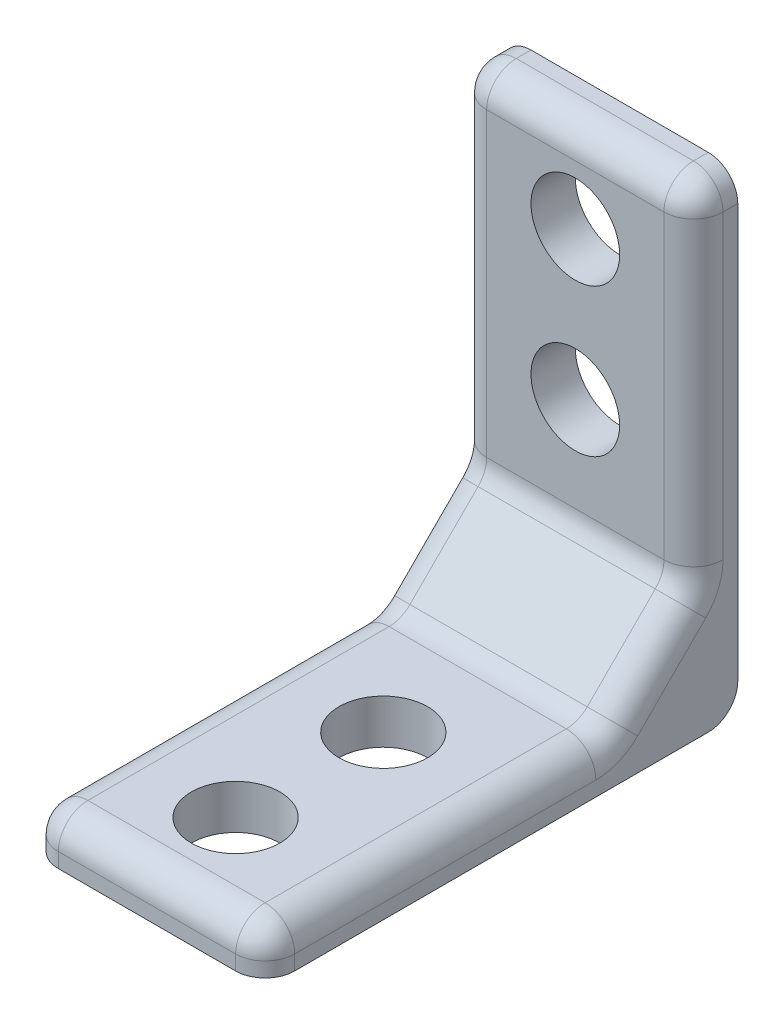
ISO-10303-21;
HEADER;
FILE_DESCRIPTION(('STEP AP214'),'2;1');
FILE_NAME('part.step','',(''),(''),'','','');
FILE_SCHEMA(('AUTOMOTIVE_DESIGN { 1 0 10303 214 1 1 1 1 }'));
ENDSEC;
DATA;
#1=APPLICATION_CONTEXT('core data for automotive mechanical design processes');
#2=APPLICATION_PROTOCOL_DEFINITION('international standard','automotive_design',2000,#1);
#3=PRODUCT_CONTEXT('',#1,'mechanical');
#4=PRODUCT('Part','Part','',(#3));
#5=PRODUCT_RELATED_PRODUCT_CATEGORY('part','',(#4));
#6=PRODUCT_DEFINITION_FORMATION('','',#4);
#7=PRODUCT_DEFINITION_CONTEXT('part definition',#1,'design');
#8=PRODUCT_DEFINITION('design','',#6,#7);
#9=PRODUCT_DEFINITION_SHAPE('','',#8);
#10=(LENGTH_UNIT() NAMED_UNIT(*) SI_UNIT(.MILLI.,.METRE.));
#11=(NAMED_UNIT(*) PLANE_ANGLE_UNIT() SI_UNIT($,.RADIAN.));
#12=(NAMED_UNIT(*) SI_UNIT($,.STERADIAN.) SOLID_ANGLE_UNIT());
#13=UNCERTAINTY_MEASURE_WITH_UNIT(LENGTH_MEASURE(1.E-05),#10,'distance_accuracy_value','');
#14=(GEOMETRIC_REPRESENTATION_CONTEXT(3) GLOBAL_UNCERTAINTY_ASSIGNED_CONTEXT((#13)) GLOBAL_UNIT_ASSIGNED_CONTEXT((#10,
#11,#12)) REPRESENTATION_CONTEXT('',''));
#15=CARTESIAN_POINT('',(0.,0.,0.));
#16=DIRECTION('',(0.,0.,1.));
#17=DIRECTION('',(1.,0.,0.));
#18=AXIS2_PLACEMENT_3D('',#15,#16,#17);
#19=CARTESIAN_POINT('',(5.08,0.,20.32));
#20=DIRECTION('',(0.,1.,0.));
#21=DIRECTION('',(0.,0.,1.));
#22=AXIS2_PLACEMENT_3D('',#19,#20,#21);
#23=PLANE('',#22);
#24=CARTESIAN_POINT('',(0.,0.,16.51));
#25=DIRECTION('',(0.,1.,0.));
#26=DIRECTION('',(0.,0.,1.));
#27=AXIS2_PLACEMENT_3D('',#24,#25,#26);
#28=CIRCLE('',#27,1.905);
#29=CARTESIAN_POINT('',(0.,0.,18.415));
#30=VERTEX_POINT('',#29);
#31=EDGE_CURVE('E436',#30,#30,#28,.T.);
#32=ORIENTED_EDGE('',*,*,#31,.T.);
#33=EDGE_LOOP('',(#32));
#34=FACE_BOUND('',#33,.T.);
#35=CARTESIAN_POINT('',(0.,0.,10.16));
#36=DIRECTION('',(0.,1.,0.));
#37=DIRECTION('',(0.,0.,1.));
#38=AXIS2_PLACEMENT_3D('',#35,#36,#37);
#39=CIRCLE('',#38,1.905);
#40=CARTESIAN_POINT('',(0.,0.,12.065));
#41=VERTEX_POINT('',#40);
#42=EDGE_CURVE('E445',#41,#41,#39,.T.);
#43=ORIENTED_EDGE('',*,*,#42,.T.);
#44=EDGE_LOOP('',(#43));
#45=FACE_BOUND('',#44,.T.);
#46=DIRECTION('',(0.,0.,-1.));
#47=VECTOR('',#46,1.);
#48=CARTESIAN_POINT('',(-5.08,0.,20.32));
#49=LINE('',#48,#47);
#50=CARTESIAN_POINT('',(-5.08,0.,19.05));
#51=VERTEX_POINT('',#50);
#52=CARTESIAN_POINT('',(-5.08,0.,1.27));
#53=VERTEX_POINT('',#52);
#54=EDGE_CURVE('E440',#51,#53,#49,.T.);
#55=ORIENTED_EDGE('',*,*,#54,.T.);
#56=DIRECTION('',(-1.,0.,0.));
#57=VECTOR('',#56,1.);
#58=CARTESIAN_POINT('',(5.08,0.,1.27));
#59=LINE('',#58,#57);
#60=CARTESIAN_POINT('',(5.08,0.,1.27));
#61=VERTEX_POINT('',#60);
#62=EDGE_CURVE('E329',#53,#61,#59,.F.);
#63=ORIENTED_EDGE('',*,*,#62,.T.);
#64=DIRECTION('',(0.,0.,-1.));
#65=VECTOR('',#64,1.);
#66=CARTESIAN_POINT('',(5.08,0.,20.32));
#67=LINE('',#66,#65);
#68=CARTESIAN_POINT('',(5.08,0.,19.05));
#69=VERTEX_POINT('',#68);
#70=EDGE_CURVE('E454',#69,#61,#67,.T.);
#71=ORIENTED_EDGE('',*,*,#70,.F.);
#72=CARTESIAN_POINT('',(3.81,0.,19.05));
#73=DIRECTION('',(0.,1.,0.));
#74=DIRECTION('',(0.,0.,1.));
#75=AXIS2_PLACEMENT_3D('',#72,#73,#74);
#76=CIRCLE('',#75,1.27);
#77=CARTESIAN_POINT('',(3.81,0.,20.32));
#78=VERTEX_POINT('',#77);
#79=EDGE_CURVE('E323',#69,#78,#76,.F.);
#80=ORIENTED_EDGE('',*,*,#79,.T.);
#81=DIRECTION('',(-1.,0.,0.));
#82=VECTOR('',#81,1.);
#83=CARTESIAN_POINT('',(5.08,0.,20.32));
#84=LINE('',#83,#82);
#85=CARTESIAN_POINT('',(-3.81,0.,20.32));
#86=VERTEX_POINT('',#85);
#87=EDGE_CURVE('E227',#78,#86,#84,.T.);
#88=ORIENTED_EDGE('',*,*,#87,.T.);
#89=CARTESIAN_POINT('',(-3.81,0.,19.05));
#90=DIRECTION('',(0.,1.,0.));
#91=DIRECTION('',(0.,0.,1.));
#92=AXIS2_PLACEMENT_3D('',#89,#90,#91);
#93=CIRCLE('',#92,1.27);
#94=EDGE_CURVE('E326',#86,#51,#93,.F.);
#95=ORIENTED_EDGE('',*,*,#94,.T.);
#96=EDGE_LOOP('',(#55,#63,#71,#80,#88,#95));
#97=FACE_BOUND('',#96,.T.);
#98=ADVANCED_FACE('F43',(#34,#45,#97),#23,.F.);
#99=CARTESIAN_POINT('',(5.08,0.,0.));
#100=DIRECTION('',(0.,0.,1.));
#101=DIRECTION('',(1.,0.,0.));
#102=AXIS2_PLACEMENT_3D('',#99,#100,#101);
#103=PLANE('',#102);
#104=CARTESIAN_POINT('',(0.,16.51,0.));
#105=DIRECTION('',(0.,0.,1.));
#106=DIRECTION('',(1.,0.,0.));
#107=AXIS2_PLACEMENT_3D('',#104,#105,#106);
#108=CIRCLE('',#107,1.905);
#109=CARTESIAN_POINT('',(1.905,16.51,0.));
#110=VERTEX_POINT('',#109);
#111=EDGE_CURVE('E453',#110,#110,#108,.T.);
#112=ORIENTED_EDGE('',*,*,#111,.T.);
#113=EDGE_LOOP('',(#112));
#114=FACE_BOUND('',#113,.T.);
#115=CARTESIAN_POINT('',(0.,10.16,0.));
#116=DIRECTION('',(0.,0.,1.));
#117=DIRECTION('',(1.,0.,0.));
#118=AXIS2_PLACEMENT_3D('',#115,#116,#117);
#119=CIRCLE('',#118,1.905);
#120=CARTESIAN_POINT('',(1.905,10.16,0.));
#121=VERTEX_POINT('',#120);
#122=EDGE_CURVE('E421',#121,#121,#119,.T.);
#123=ORIENTED_EDGE('',*,*,#122,.T.);
#124=EDGE_LOOP('',(#123));
#125=FACE_BOUND('',#124,.T.);
#126=DIRECTION('',(0.,1.,0.));
#127=VECTOR('',#126,1.);
#128=CARTESIAN_POINT('',(5.08,0.,0.));
#129=LINE('',#128,#127);
#130=CARTESIAN_POINT('',(5.08,1.27,0.));
#131=VERTEX_POINT('',#130);
#132=CARTESIAN_POINT('',(5.08,19.05,0.));
#133=VERTEX_POINT('',#132);
#134=EDGE_CURVE('E458',#131,#133,#129,.T.);
#135=ORIENTED_EDGE('',*,*,#134,.F.);
#136=DIRECTION('',(-1.,0.,0.));
#137=VECTOR('',#136,1.);
#138=CARTESIAN_POINT('',(5.08,1.27,0.));
#139=LINE('',#138,#137);
#140=CARTESIAN_POINT('',(-5.08,1.27,0.));
#141=VERTEX_POINT('',#140);
#142=EDGE_CURVE('E319',#131,#141,#139,.T.);
#143=ORIENTED_EDGE('',*,*,#142,.T.);
#144=DIRECTION('',(0.,1.,0.));
#145=VECTOR('',#144,1.);
#146=CARTESIAN_POINT('',(-5.08,0.,0.));
#147=LINE('',#146,#145);
#148=CARTESIAN_POINT('',(-5.08,19.05,0.));
#149=VERTEX_POINT('',#148);
#150=EDGE_CURVE('E459',#141,#149,#147,.T.);
#151=ORIENTED_EDGE('',*,*,#150,.T.);
#152=CARTESIAN_POINT('',(-3.81,19.05,0.));
#153=DIRECTION('',(0.,0.,1.));
#154=DIRECTION('',(1.,0.,0.));
#155=AXIS2_PLACEMENT_3D('',#152,#153,#154);
#156=CIRCLE('',#155,1.27);
#157=CARTESIAN_POINT('',(-3.81,20.32,0.));
#158=VERTEX_POINT('',#157);
#159=EDGE_CURVE('E316',#149,#158,#156,.F.);
#160=ORIENTED_EDGE('',*,*,#159,.T.);
#161=DIRECTION('',(-1.,0.,0.));
#162=VECTOR('',#161,1.);
#163=CARTESIAN_POINT('',(5.08,20.32,0.));
#164=LINE('',#163,#162);
#165=CARTESIAN_POINT('',(3.81,20.32,0.));
#166=VERTEX_POINT('',#165);
#167=EDGE_CURVE('E223',#166,#158,#164,.T.);
#168=ORIENTED_EDGE('',*,*,#167,.F.);
#169=CARTESIAN_POINT('',(3.81,19.05,0.));
#170=DIRECTION('',(0.,0.,1.));
#171=DIRECTION('',(1.,0.,0.));
#172=AXIS2_PLACEMENT_3D('',#169,#170,#171);
#173=CIRCLE('',#172,1.27);
#174=EDGE_CURVE('E313',#166,#133,#173,.F.);
#175=ORIENTED_EDGE('',*,*,#174,.T.);
#176=EDGE_LOOP('',(#135,#143,#151,#160,#168,#175));
#177=FACE_BOUND('',#176,.T.);
#178=ADVANCED_FACE('F495',(#114,#125,#177),#103,.F.);
#179=CARTESIAN_POINT('',(5.08,20.32,0.));
#180=DIRECTION('',(0.,-1.,0.));
#181=DIRECTION('',(0.,0.,-1.));
#182=AXIS2_PLACEMENT_3D('',#179,#180,#181);
#183=PLANE('',#182);
#184=ORIENTED_EDGE('',*,*,#167,.T.);
#185=DIRECTION('',(0.,0.,1.));
#186=VECTOR('',#185,1.);
#187=CARTESIAN_POINT('',(-3.81,20.32,0.));
#188=LINE('',#187,#186);
#189=CARTESIAN_POINT('',(-3.81,20.32,0.635));
#190=VERTEX_POINT('',#189);
#191=EDGE_CURVE('E338',#158,#190,#188,.T.);
#192=ORIENTED_EDGE('',*,*,#191,.T.);
#193=DIRECTION('',(-1.,0.,0.));
#194=VECTOR('',#193,1.);
#195=CARTESIAN_POINT('',(5.08,20.32,0.635));
#196=LINE('',#195,#194);
#197=CARTESIAN_POINT('',(3.81,20.32,0.635));
#198=VERTEX_POINT('',#197);
#199=EDGE_CURVE('E332',#190,#198,#196,.F.);
#200=ORIENTED_EDGE('',*,*,#199,.T.);
#201=DIRECTION('',(0.,0.,1.));
#202=VECTOR('',#201,1.);
#203=CARTESIAN_POINT('',(3.81,20.32,0.));
#204=LINE('',#203,#202);
#205=EDGE_CURVE('E335',#198,#166,#204,.F.);
#206=ORIENTED_EDGE('',*,*,#205,.T.);
#207=EDGE_LOOP('',(#184,#192,#200,#206));
#208=FACE_BOUND('',#207,.T.);
#209=ADVANCED_FACE('F553',(#208),#183,.F.);
#210=CARTESIAN_POINT('',(5.08,20.32,1.905));
#211=DIRECTION('',(0.,0.,-1.));
#212=DIRECTION('',(0.,1.,0.));
#213=AXIS2_PLACEMENT_3D('',#210,#211,#212);
#214=PLANE('',#213);
#215=DIRECTION('',(0.,-1.,0.));
#216=VECTOR('',#215,1.);
#217=CARTESIAN_POINT('',(-3.81,20.32,1.905));
#218=LINE('',#217,#216);
#219=CARTESIAN_POINT('',(-3.81,19.05,1.905));
#220=VERTEX_POINT('',#219);
#221=CARTESIAN_POINT('',(-3.81,6.10199380268185,1.905));
#222=VERTEX_POINT('',#221);
#223=EDGE_CURVE('E194',#220,#222,#218,.T.);
#224=ORIENTED_EDGE('',*,*,#223,.T.);
#225=DIRECTION('',(1.,0.,0.));
#226=VECTOR('',#225,1.);
#227=CARTESIAN_POINT('',(5.08,6.10199380268185,1.905));
#228=LINE('',#227,#226);
#229=CARTESIAN_POINT('',(3.81,6.10199380268185,1.905));
#230=VERTEX_POINT('',#229);
#231=EDGE_CURVE('E189',#222,#230,#228,.T.);
#232=ORIENTED_EDGE('',*,*,#231,.T.);
#233=DIRECTION('',(0.,-1.,0.));
#234=VECTOR('',#233,1.);
#235=CARTESIAN_POINT('',(3.81,20.32,1.905));
#236=LINE('',#235,#234);
#237=CARTESIAN_POINT('',(3.81,19.05,1.905));
#238=VERTEX_POINT('',#237);
#239=EDGE_CURVE('E180',#230,#238,#236,.F.);
#240=ORIENTED_EDGE('',*,*,#239,.T.);
#241=DIRECTION('',(-1.,0.,0.));
#242=VECTOR('',#241,1.);
#243=CARTESIAN_POINT('',(5.08,19.05,1.905));
#244=LINE('',#243,#242);
#245=EDGE_CURVE('E186',#238,#220,#244,.T.);
#246=ORIENTED_EDGE('',*,*,#245,.T.);
#247=EDGE_LOOP('',(#224,#232,#240,#246));
#248=FACE_BOUND('',#247,.T.);
#249=CARTESIAN_POINT('',(0.,16.51,1.905));
#250=DIRECTION('',(0.,0.,1.));
#251=DIRECTION('',(1.,0.,0.));
#252=AXIS2_PLACEMENT_3D('',#249,#250,#251);
#253=CIRCLE('',#252,1.905);
#254=CARTESIAN_POINT('',(1.905,16.51,1.905));
#255=VERTEX_POINT('',#254);
#256=EDGE_CURVE('E432',#255,#255,#253,.T.);
#257=ORIENTED_EDGE('',*,*,#256,.F.);
#258=EDGE_LOOP('',(#257));
#259=FACE_BOUND('',#258,.T.);
#260=CARTESIAN_POINT('',(0.,10.16,1.905));
#261=DIRECTION('',(0.,0.,1.));
#262=DIRECTION('',(1.,0.,0.));
#263=AXIS2_PLACEMENT_3D('',#260,#261,#262);
#264=CIRCLE('',#263,1.905);
#265=CARTESIAN_POINT('',(1.905,10.16,1.905));
#266=VERTEX_POINT('',#265);
#267=EDGE_CURVE('E426',#266,#266,#264,.T.);
#268=ORIENTED_EDGE('',*,*,#267,.F.);
#269=EDGE_LOOP('',(#268));
#270=FACE_BOUND('',#269,.T.);
#271=ADVANCED_FACE('F183',(#248,#259,#270),#214,.F.);
#272=CARTESIAN_POINT('',(5.08,1.905,1.905));
#273=DIRECTION('',(0.,-1.,0.));
#274=DIRECTION('',(0.,0.,-1.));
#275=AXIS2_PLACEMENT_3D('',#272,#273,#274);
#276=PLANE('',#275);
#277=DIRECTION('',(0.,0.,1.));
#278=VECTOR('',#277,1.);
#279=CARTESIAN_POINT('',(3.81,1.905,5.57594257846805));
#280=LINE('',#279,#278);
#281=CARTESIAN_POINT('',(3.81,1.905,19.05));
#282=VERTEX_POINT('',#281);
#283=CARTESIAN_POINT('',(3.81,1.905,6.10199380268188));
#284=VERTEX_POINT('',#283);
#285=EDGE_CURVE('E306',#282,#284,#280,.F.);
#286=ORIENTED_EDGE('',*,*,#285,.T.);
#287=DIRECTION('',(1.,0.,0.));
#288=VECTOR('',#287,1.);
#289=CARTESIAN_POINT('',(5.08,1.905,6.10199380268188));
#290=LINE('',#289,#288);
#291=CARTESIAN_POINT('',(-3.81,1.905,6.10199380268188));
#292=VERTEX_POINT('',#291);
#293=EDGE_CURVE('E309',#284,#292,#290,.F.);
#294=ORIENTED_EDGE('',*,*,#293,.T.);
#295=DIRECTION('',(0.,0.,1.));
#296=VECTOR('',#295,1.);
#297=CARTESIAN_POINT('',(-3.81,1.905,1.905));
#298=LINE('',#297,#296);
#299=CARTESIAN_POINT('',(-3.81,1.905,19.05));
#300=VERTEX_POINT('',#299);
#301=EDGE_CURVE('E300',#292,#300,#298,.T.);
#302=ORIENTED_EDGE('',*,*,#301,.T.);
#303=DIRECTION('',(-1.,0.,0.));
#304=VECTOR('',#303,1.);
#305=CARTESIAN_POINT('',(5.08,1.905,19.05));
#306=LINE('',#305,#304);
#307=EDGE_CURVE('E303',#300,#282,#306,.F.);
#308=ORIENTED_EDGE('',*,*,#307,.T.);
#309=EDGE_LOOP('',(#286,#294,#302,#308));
#310=FACE_BOUND('',#309,.T.);
#311=CARTESIAN_POINT('',(0.,1.905,16.51));
#312=DIRECTION('',(0.,1.,0.));
#313=DIRECTION('',(0.,0.,1.));
#314=AXIS2_PLACEMENT_3D('',#311,#312,#313);
#315=CIRCLE('',#314,1.905);
#316=CARTESIAN_POINT('',(0.,1.905,18.415));
#317=VERTEX_POINT('',#316);
#318=EDGE_CURVE('E441',#317,#317,#315,.T.);
#319=ORIENTED_EDGE('',*,*,#318,.F.);
#320=EDGE_LOOP('',(#319));
#321=FACE_BOUND('',#320,.T.);
#322=CARTESIAN_POINT('',(0.,1.905,10.16));
#323=DIRECTION('',(0.,1.,0.));
#324=DIRECTION('',(0.,0.,1.));
#325=AXIS2_PLACEMENT_3D('',#322,#323,#324);
#326=CIRCLE('',#325,1.905);
#327=CARTESIAN_POINT('',(0.,1.905,12.065));
#328=VERTEX_POINT('',#327);
#329=EDGE_CURVE('E449',#328,#328,#326,.T.);
#330=ORIENTED_EDGE('',*,*,#329,.F.);
#331=EDGE_LOOP('',(#330));
#332=FACE_BOUND('',#331,.T.);
#333=ADVANCED_FACE('F560',(#310,#321,#332),#276,.F.);
#334=CARTESIAN_POINT('',(5.08,1.905,20.32));
#335=DIRECTION('',(0.,0.,-1.));
#336=DIRECTION('',(-1.,0.,0.));
#337=AXIS2_PLACEMENT_3D('',#334,#335,#336);
#338=PLANE('',#337);
#339=DIRECTION('',(-1.,0.,0.));
#340=VECTOR('',#339,1.);
#341=CARTESIAN_POINT('',(5.08,0.635,20.32));
#342=LINE('',#341,#340);
#343=CARTESIAN_POINT('',(3.81,0.635,20.32));
#344=VERTEX_POINT('',#343);
#345=CARTESIAN_POINT('',(-3.81,0.635,20.32));
#346=VERTEX_POINT('',#345);
#347=EDGE_CURVE('E60',#344,#346,#342,.T.);
#348=ORIENTED_EDGE('',*,*,#347,.T.);
#349=DIRECTION('',(0.,-1.,0.));
#350=VECTOR('',#349,1.);
#351=CARTESIAN_POINT('',(-3.81,1.905,20.32));
#352=LINE('',#351,#350);
#353=EDGE_CURVE('E11',#346,#86,#352,.T.);
#354=ORIENTED_EDGE('',*,*,#353,.T.);
#355=ORIENTED_EDGE('',*,*,#87,.F.);
#356=DIRECTION('',(0.,-1.,0.));
#357=VECTOR('',#356,1.);
#358=CARTESIAN_POINT('',(3.81,1.905,20.32));
#359=LINE('',#358,#357);
#360=EDGE_CURVE('E53',#78,#344,#359,.F.);
#361=ORIENTED_EDGE('',*,*,#360,.T.);
#362=EDGE_LOOP('',(#348,#354,#355,#361));
#363=FACE_BOUND('',#362,.T.);
#364=ADVANCED_FACE('F646',(#363),#338,.F.);
#365=CARTESIAN_POINT('',(5.08,0.,0.));
#366=DIRECTION('',(1.,0.,0.));
#367=DIRECTION('',(0.,0.,-1.));
#368=AXIS2_PLACEMENT_3D('',#365,#366,#367);
#369=PLANE('',#368);
#370=ORIENTED_EDGE('',*,*,#70,.T.);
#371=CARTESIAN_POINT('',(5.08,1.27,1.27));
#372=DIRECTION('',(1.,0.,0.));
#373=DIRECTION('',(0.,0.,-1.));
#374=AXIS2_PLACEMENT_3D('',#371,#372,#373);
#375=CIRCLE('',#374,1.27);
#376=EDGE_CURVE('E284',#61,#131,#375,.T.);
#377=ORIENTED_EDGE('',*,*,#376,.T.);
#378=ORIENTED_EDGE('',*,*,#134,.T.);
#379=DIRECTION('',(0.,0.,1.));
#380=VECTOR('',#379,1.);
#381=CARTESIAN_POINT('',(5.08,19.05,1.905));
#382=LINE('',#381,#380);
#383=CARTESIAN_POINT('',(5.08,19.05,0.635));
#384=VERTEX_POINT('',#383);
#385=EDGE_CURVE('E281',#133,#384,#382,.T.);
#386=ORIENTED_EDGE('',*,*,#385,.T.);
#387=DIRECTION('',(0.,-1.,0.));
#388=VECTOR('',#387,1.);
#389=CARTESIAN_POINT('',(5.08,5.57594257846802,0.634999999999998));
#390=LINE('',#389,#388);
#391=CARTESIAN_POINT('',(5.08,6.10199380268185,0.634999999999998));
#392=VERTEX_POINT('',#391);
#393=EDGE_CURVE('E201',#384,#392,#390,.T.);
#394=ORIENTED_EDGE('',*,*,#393,.T.);
#395=CARTESIAN_POINT('',(5.08,6.10199380268185,3.175));
#396=DIRECTION('',(1.,0.,0.));
#397=DIRECTION('',(0.,0.,-1.));
#398=AXIS2_PLACEMENT_3D('',#395,#396,#397);
#399=CIRCLE('',#398,2.54);
#400=CARTESIAN_POINT('',(5.08,4.30594257846801,1.37894877578618));
#401=VERTEX_POINT('',#400);
#402=EDGE_CURVE('E275',#401,#392,#399,.T.);
#403=ORIENTED_EDGE('',*,*,#402,.F.);
#404=DIRECTION('',(0.,-0.707106781186544,0.707106781186551));
#405=VECTOR('',#404,1.);
#406=CARTESIAN_POINT('',(5.08,2.84244567712712,2.84244567712709));
#407=LINE('',#406,#405);
#408=CARTESIAN_POINT('',(5.08,1.37894877578616,4.30594257846806));
#409=VERTEX_POINT('',#408);
#410=EDGE_CURVE('E272',#401,#409,#407,.T.);
#411=ORIENTED_EDGE('',*,*,#410,.T.);
#412=CARTESIAN_POINT('',(5.08,3.175,6.10199380268188));
#413=DIRECTION('',(1.,0.,0.));
#414=DIRECTION('',(0.,0.,-1.));
#415=AXIS2_PLACEMENT_3D('',#412,#413,#414);
#416=CIRCLE('',#415,2.54);
#417=CARTESIAN_POINT('',(5.08,0.635000000000001,6.10199380268188));
#418=VERTEX_POINT('',#417);
#419=EDGE_CURVE('E268',#418,#409,#416,.T.);
#420=ORIENTED_EDGE('',*,*,#419,.F.);
#421=DIRECTION('',(0.,0.,1.));
#422=VECTOR('',#421,1.);
#423=CARTESIAN_POINT('',(5.08,0.635,20.32));
#424=LINE('',#423,#422);
#425=CARTESIAN_POINT('',(5.08,0.635,19.05));
#426=VERTEX_POINT('',#425);
#427=EDGE_CURVE('E265',#418,#426,#424,.T.);
#428=ORIENTED_EDGE('',*,*,#427,.T.);
#429=DIRECTION('',(0.,-1.,0.));
#430=VECTOR('',#429,1.);
#431=CARTESIAN_POINT('',(5.08,0.,19.05));
#432=LINE('',#431,#430);
#433=EDGE_CURVE('E262',#426,#69,#432,.T.);
#434=ORIENTED_EDGE('',*,*,#433,.T.);
#435=EDGE_LOOP('',(#370,#377,#378,#386,#394,#403,#411,#420,#428,#434));
#436=FACE_BOUND('',#435,.T.);
#437=ADVANCED_FACE('F492',(#436),#369,.T.);
#438=CARTESIAN_POINT('',(-5.08,0.,0.));
#439=DIRECTION('',(1.,0.,0.));
#440=DIRECTION('',(0.,0.,-1.));
#441=AXIS2_PLACEMENT_3D('',#438,#439,#440);
#442=PLANE('',#441);
#443=ORIENTED_EDGE('',*,*,#150,.F.);
#444=CARTESIAN_POINT('',(-5.08,1.27,1.27));
#445=DIRECTION('',(1.,0.,0.));
#446=DIRECTION('',(0.,0.,-1.));
#447=AXIS2_PLACEMENT_3D('',#444,#445,#446);
#448=CIRCLE('',#447,1.27);
#449=EDGE_CURVE('E259',#141,#53,#448,.F.);
#450=ORIENTED_EDGE('',*,*,#449,.T.);
#451=ORIENTED_EDGE('',*,*,#54,.F.);
#452=DIRECTION('',(0.,-1.,0.));
#453=VECTOR('',#452,1.);
#454=CARTESIAN_POINT('',(-5.08,0.,19.05));
#455=LINE('',#454,#453);
#456=CARTESIAN_POINT('',(-5.08,0.635,19.05));
#457=VERTEX_POINT('',#456);
#458=EDGE_CURVE('E242',#51,#457,#455,.F.);
#459=ORIENTED_EDGE('',*,*,#458,.T.);
#460=DIRECTION('',(0.,0.,1.));
#461=VECTOR('',#460,1.);
#462=CARTESIAN_POINT('',(-5.08,0.635000000000002,0.));
#463=LINE('',#462,#461);
#464=CARTESIAN_POINT('',(-5.08,0.635000000000001,6.10199380268188));
#465=VERTEX_POINT('',#464);
#466=EDGE_CURVE('E239',#457,#465,#463,.F.);
#467=ORIENTED_EDGE('',*,*,#466,.T.);
#468=CARTESIAN_POINT('',(-5.08,3.175,6.10199380268188));
#469=DIRECTION('',(1.,0.,0.));
#470=DIRECTION('',(0.,0.,-1.));
#471=AXIS2_PLACEMENT_3D('',#468,#469,#470);
#472=CIRCLE('',#471,2.54);
#473=CARTESIAN_POINT('',(-5.08,1.37894877578616,4.30594257846806));
#474=VERTEX_POINT('',#473);
#475=EDGE_CURVE('E235',#474,#465,#472,.F.);
#476=ORIENTED_EDGE('',*,*,#475,.F.);
#477=DIRECTION('',(0.,0.707106781186544,-0.707106781186551));
#478=VECTOR('',#477,1.);
#479=CARTESIAN_POINT('',(-5.08,4.6779169663611,1.00697438789309));
#480=LINE('',#479,#478);
#481=CARTESIAN_POINT('',(-5.08,4.30594257846801,1.37894877578618));
#482=VERTEX_POINT('',#481);
#483=EDGE_CURVE('E245',#474,#482,#480,.T.);
#484=ORIENTED_EDGE('',*,*,#483,.T.);
#485=CARTESIAN_POINT('',(-5.08,6.10199380268185,3.175));
#486=DIRECTION('',(1.,0.,0.));
#487=DIRECTION('',(0.,0.,-1.));
#488=AXIS2_PLACEMENT_3D('',#485,#486,#487);
#489=CIRCLE('',#488,2.54);
#490=CARTESIAN_POINT('',(-5.08,6.10199380268185,0.634999999999998));
#491=VERTEX_POINT('',#490);
#492=EDGE_CURVE('E248',#491,#482,#489,.F.);
#493=ORIENTED_EDGE('',*,*,#492,.F.);
#494=DIRECTION('',(0.,-1.,0.));
#495=VECTOR('',#494,1.);
#496=CARTESIAN_POINT('',(-5.08,0.,0.634999999999998));
#497=LINE('',#496,#495);
#498=CARTESIAN_POINT('',(-5.08,19.05,0.635));
#499=VERTEX_POINT('',#498);
#500=EDGE_CURVE('E252',#491,#499,#497,.F.);
#501=ORIENTED_EDGE('',*,*,#500,.T.);
#502=DIRECTION('',(0.,0.,1.));
#503=VECTOR('',#502,1.);
#504=CARTESIAN_POINT('',(-5.08,19.05,0.));
#505=LINE('',#504,#503);
#506=EDGE_CURVE('E256',#499,#149,#505,.F.);
#507=ORIENTED_EDGE('',*,*,#506,.T.);
#508=EDGE_LOOP('',(#443,#450,#451,#459,#467,#476,#484,#493,#501,#507));
#509=FACE_BOUND('',#508,.T.);
#510=ADVANCED_FACE('F483',(#509),#442,.F.);
#511=CARTESIAN_POINT('',(0.,0.,10.16));
#512=DIRECTION('',(0.,1.,0.));
#513=DIRECTION('',(0.,0.,1.));
#514=AXIS2_PLACEMENT_3D('',#511,#512,#513);
#515=CYLINDRICAL_SURFACE('',#514,1.905);
#516=ORIENTED_EDGE('',*,*,#42,.F.);
#517=EDGE_LOOP('',(#516));
#518=FACE_BOUND('',#517,.T.);
#519=ORIENTED_EDGE('',*,*,#329,.T.);
#520=EDGE_LOOP('',(#519));
#521=FACE_BOUND('',#520,.T.);
#522=ADVANCED_FACE('F639',(#518,#521),#515,.F.);
#523=CARTESIAN_POINT('',(0.,0.,16.51));
#524=DIRECTION('',(0.,1.,0.));
#525=DIRECTION('',(0.,0.,1.));
#526=AXIS2_PLACEMENT_3D('',#523,#524,#525);
#527=CYLINDRICAL_SURFACE('',#526,1.905);
#528=ORIENTED_EDGE('',*,*,#31,.F.);
#529=EDGE_LOOP('',(#528));
#530=FACE_BOUND('',#529,.T.);
#531=ORIENTED_EDGE('',*,*,#318,.T.);
#532=EDGE_LOOP('',(#531));
#533=FACE_BOUND('',#532,.T.);
#534=ADVANCED_FACE('F635',(#530,#533),#527,.F.);
#535=CARTESIAN_POINT('',(0.,10.16,0.));
#536=DIRECTION('',(0.,0.,1.));
#537=DIRECTION('',(1.,0.,0.));
#538=AXIS2_PLACEMENT_3D('',#535,#536,#537);
#539=CYLINDRICAL_SURFACE('',#538,1.905);
#540=ORIENTED_EDGE('',*,*,#122,.F.);
#541=EDGE_LOOP('',(#540));
#542=FACE_BOUND('',#541,.T.);
#543=ORIENTED_EDGE('',*,*,#267,.T.);
#544=EDGE_LOOP('',(#543));
#545=FACE_BOUND('',#544,.T.);
#546=ADVANCED_FACE('F629',(#542,#545),#539,.F.);
#547=CARTESIAN_POINT('',(0.,16.51,0.));
#548=DIRECTION('',(0.,0.,1.));
#549=DIRECTION('',(1.,0.,0.));
#550=AXIS2_PLACEMENT_3D('',#547,#548,#549);
#551=CYLINDRICAL_SURFACE('',#550,1.905);
#552=ORIENTED_EDGE('',*,*,#111,.F.);
#553=EDGE_LOOP('',(#552));
#554=FACE_BOUND('',#553,.T.);
#555=ORIENTED_EDGE('',*,*,#256,.T.);
#556=EDGE_LOOP('',(#555));
#557=FACE_BOUND('',#556,.T.);
#558=ADVANCED_FACE('F623',(#554,#557),#551,.F.);
#559=CARTESIAN_POINT('',(-10.2714967811624,1.905,5.57594257846805));
#560=DIRECTION('',(0.,0.707106781186551,0.707106781186544));
#561=DIRECTION('',(0.,-0.707106781186544,0.707106781186551));
#562=AXIS2_PLACEMENT_3D('',#559,#560,#561);
#563=PLANE('',#562);
#564=DIRECTION('',(0.,-0.707106781186544,0.707106781186551));
#565=VECTOR('',#564,1.);
#566=CARTESIAN_POINT('',(3.81,1.905,5.57594257846805));
#567=LINE('',#566,#565);
#568=CARTESIAN_POINT('',(3.81,2.27697438789308,5.20396819057497));
#569=VERTEX_POINT('',#568);
#570=CARTESIAN_POINT('',(3.81,5.20396819057493,2.27697438789309));
#571=VERTEX_POINT('',#570);
#572=EDGE_CURVE('E293',#569,#571,#567,.F.);
#573=ORIENTED_EDGE('',*,*,#572,.T.);
#574=DIRECTION('',(1.,0.,0.));
#575=VECTOR('',#574,1.);
#576=CARTESIAN_POINT('',(-10.2714967811624,5.20396819057493,2.27697438789309));
#577=LINE('',#576,#575);
#578=CARTESIAN_POINT('',(-3.81,5.20396819057493,2.27697438789309));
#579=VERTEX_POINT('',#578);
#580=EDGE_CURVE('E296',#571,#579,#577,.F.);
#581=ORIENTED_EDGE('',*,*,#580,.T.);
#582=DIRECTION('',(0.,0.707106781186544,-0.707106781186551));
#583=VECTOR('',#582,1.);
#584=CARTESIAN_POINT('',(-3.81,1.905,5.57594257846805));
#585=LINE('',#584,#583);
#586=CARTESIAN_POINT('',(-3.81,2.27697438789308,5.20396819057497));
#587=VERTEX_POINT('',#586);
#588=EDGE_CURVE('E287',#579,#587,#585,.F.);
#589=ORIENTED_EDGE('',*,*,#588,.T.);
#590=DIRECTION('',(1.,0.,0.));
#591=VECTOR('',#590,1.);
#592=CARTESIAN_POINT('',(-10.2714967811624,2.27697438789308,5.20396819057497));
#593=LINE('',#592,#591);
#594=EDGE_CURVE('E290',#587,#569,#593,.T.);
#595=ORIENTED_EDGE('',*,*,#594,.T.);
#596=EDGE_LOOP('',(#573,#581,#589,#595));
#597=FACE_BOUND('',#596,.T.);
#598=ADVANCED_FACE('F619',(#597),#563,.T.);
#599=CARTESIAN_POINT('',(3.81,0.,19.05));
#600=DIRECTION('',(0.,1.,0.));
#601=DIRECTION('',(0.,0.,1.));
#602=AXIS2_PLACEMENT_3D('',#599,#600,#601);
#603=CYLINDRICAL_SURFACE('',#602,1.27);
#604=CARTESIAN_POINT('',(3.81,0.635,19.05));
#605=DIRECTION('',(0.,1.,0.));
#606=DIRECTION('',(-1.,0.,0.));
#607=AXIS2_PLACEMENT_3D('',#604,#605,#606);
#608=CIRCLE('',#607,1.27);
#609=EDGE_CURVE('E47',#344,#426,#608,.T.);
#610=ORIENTED_EDGE('',*,*,#609,.F.);
#611=ORIENTED_EDGE('',*,*,#360,.F.);
#612=ORIENTED_EDGE('',*,*,#79,.F.);
#613=ORIENTED_EDGE('',*,*,#433,.F.);
#614=EDGE_LOOP('',(#610,#611,#612,#613));
#615=FACE_BOUND('',#614,.T.);
#616=ADVANCED_FACE('F519',(#615),#603,.T.);
#617=CARTESIAN_POINT('',(3.81,0.635,19.05));
#618=DIRECTION('',(1.,0.,0.));
#619=DIRECTION('',(0.,0.,-1.));
#620=AXIS2_PLACEMENT_3D('',#617,#618,#619);
#621=SPHERICAL_SURFACE('',#620,1.27);
#622=CARTESIAN_POINT('',(3.81,0.635,19.05));
#623=DIRECTION('',(1.,0.,0.));
#624=DIRECTION('',(0.,0.,-1.));
#625=AXIS2_PLACEMENT_3D('',#622,#623,#624);
#626=CIRCLE('',#625,1.27);
#627=EDGE_CURVE('E409',#344,#282,#626,.F.);
#628=ORIENTED_EDGE('',*,*,#627,.F.);
#629=ORIENTED_EDGE('',*,*,#609,.T.);
#630=CARTESIAN_POINT('',(3.81,0.635,19.05));
#631=DIRECTION('',(0.,0.,1.));
#632=DIRECTION('',(1.,0.,0.));
#633=AXIS2_PLACEMENT_3D('',#630,#631,#632);
#634=CIRCLE('',#633,1.27);
#635=EDGE_CURVE('E412',#282,#426,#634,.F.);
#636=ORIENTED_EDGE('',*,*,#635,.F.);
#637=EDGE_LOOP('',(#628,#629,#636));
#638=FACE_BOUND('',#637,.T.);
#639=ADVANCED_FACE('F520',(#638),#621,.T.);
#640=CARTESIAN_POINT('',(3.81,0.635000000000002,0.));
#641=DIRECTION('',(0.,0.,-1.));
#642=DIRECTION('',(0.,1.,0.));
#643=AXIS2_PLACEMENT_3D('',#640,#641,#642);
#644=CYLINDRICAL_SURFACE('',#643,1.27);
#645=ORIENTED_EDGE('',*,*,#635,.T.);
#646=ORIENTED_EDGE('',*,*,#427,.F.);
#647=CARTESIAN_POINT('',(3.81,0.635000000000001,6.10199380268188));
#648=DIRECTION('',(0.,0.,-1.));
#649=DIRECTION('',(-1.,0.,0.));
#650=AXIS2_PLACEMENT_3D('',#647,#648,#649);
#651=CIRCLE('',#650,1.27);
#652=EDGE_CURVE('E405',#284,#418,#651,.T.);
#653=ORIENTED_EDGE('',*,*,#652,.F.);
#654=ORIENTED_EDGE('',*,*,#285,.F.);
#655=EDGE_LOOP('',(#645,#646,#653,#654));
#656=FACE_BOUND('',#655,.T.);
#657=ADVANCED_FACE('F516',(#656),#644,.T.);
#658=CARTESIAN_POINT('',(5.08,0.635,19.05));
#659=DIRECTION('',(-1.,0.,0.));
#660=DIRECTION('',(0.,0.,1.));
#661=AXIS2_PLACEMENT_3D('',#658,#659,#660);
#662=CYLINDRICAL_SURFACE('',#661,1.27);
#663=ORIENTED_EDGE('',*,*,#627,.T.);
#664=ORIENTED_EDGE('',*,*,#307,.F.);
#665=CARTESIAN_POINT('',(-3.81,0.635,19.05));
#666=DIRECTION('',(-1.,0.,0.));
#667=DIRECTION('',(0.,0.,1.));
#668=AXIS2_PLACEMENT_3D('',#665,#666,#667);
#669=CIRCLE('',#668,1.27);
#670=EDGE_CURVE('E401',#346,#300,#669,.T.);
#671=ORIENTED_EDGE('',*,*,#670,.F.);
#672=ORIENTED_EDGE('',*,*,#347,.F.);
#673=EDGE_LOOP('',(#663,#664,#671,#672));
#674=FACE_BOUND('',#673,.T.);
#675=ADVANCED_FACE('F523',(#674),#662,.T.);
#676=CARTESIAN_POINT('',(-3.81,1.905,19.05));
#677=DIRECTION('',(0.,-1.,0.));
#678=DIRECTION('',(0.,0.,-1.));
#679=AXIS2_PLACEMENT_3D('',#676,#677,#678);
#680=CYLINDRICAL_SURFACE('',#679,1.27);
#681=ORIENTED_EDGE('',*,*,#94,.F.);
#682=ORIENTED_EDGE('',*,*,#353,.F.);
#683=CARTESIAN_POINT('',(-3.81,0.635,19.05));
#684=DIRECTION('',(0.,1.,0.));
#685=DIRECTION('',(0.,0.,1.));
#686=AXIS2_PLACEMENT_3D('',#683,#684,#685);
#687=CIRCLE('',#686,1.27);
#688=EDGE_CURVE('E397',#457,#346,#687,.T.);
#689=ORIENTED_EDGE('',*,*,#688,.F.);
#690=ORIENTED_EDGE('',*,*,#458,.F.);
#691=EDGE_LOOP('',(#681,#682,#689,#690));
#692=FACE_BOUND('',#691,.T.);
#693=ADVANCED_FACE('F477',(#692),#680,.T.);
#694=CARTESIAN_POINT('',(3.81,3.175,6.10199380268188));
#695=DIRECTION('',(1.,0.,0.));
#696=DIRECTION('',(0.,0.,-1.));
#697=AXIS2_PLACEMENT_3D('',#694,#695,#696);
#698=TOROIDAL_SURFACE('',#697,2.54,1.27);
#699=ORIENTED_EDGE('',*,*,#652,.T.);
#700=ORIENTED_EDGE('',*,*,#419,.T.);
#701=CARTESIAN_POINT('',(3.81,1.37894877578616,4.30594257846806));
#702=DIRECTION('',(0.,-0.707106781186544,0.707106781186551));
#703=DIRECTION('',(0.,-0.707106781186551,-0.707106781186544));
#704=AXIS2_PLACEMENT_3D('',#701,#702,#703);
#705=CIRCLE('',#704,1.27);
#706=EDGE_CURVE('E393',#569,#409,#705,.F.);
#707=ORIENTED_EDGE('',*,*,#706,.F.);
#708=CARTESIAN_POINT('',(3.81,3.175,6.10199380268188));
#709=DIRECTION('',(1.,0.,0.));
#710=DIRECTION('',(0.,0.,-1.));
#711=AXIS2_PLACEMENT_3D('',#708,#709,#710);
#712=CIRCLE('',#711,1.27);
#713=EDGE_CURVE('E389',#284,#569,#712,.T.);
#714=ORIENTED_EDGE('',*,*,#713,.F.);
#715=EDGE_LOOP('',(#699,#700,#707,#714));
#716=FACE_BOUND('',#715,.T.);
#717=ADVANCED_FACE('F512',(#716),#698,.T.);
#718=CARTESIAN_POINT('',(-3.81,0.635,19.05));
#719=DIRECTION('',(0.,0.,1.));
#720=DIRECTION('',(0.,-1.,0.));
#721=AXIS2_PLACEMENT_3D('',#718,#719,#720);
#722=SPHERICAL_SURFACE('',#721,1.27);
#723=ORIENTED_EDGE('',*,*,#688,.T.);
#724=ORIENTED_EDGE('',*,*,#670,.T.);
#725=CARTESIAN_POINT('',(-3.81,0.635,19.05));
#726=DIRECTION('',(0.,0.,1.));
#727=DIRECTION('',(1.,0.,0.));
#728=AXIS2_PLACEMENT_3D('',#725,#726,#727);
#729=CIRCLE('',#728,1.27);
#730=EDGE_CURVE('E385',#457,#300,#729,.F.);
#731=ORIENTED_EDGE('',*,*,#730,.F.);
#732=EDGE_LOOP('',(#723,#724,#731));
#733=FACE_BOUND('',#732,.T.);
#734=ADVANCED_FACE('F525',(#733),#722,.T.);
#735=CARTESIAN_POINT('',(3.81,19.05,0.));
#736=DIRECTION('',(0.,0.,-1.));
#737=DIRECTION('',(-1.,0.,0.));
#738=AXIS2_PLACEMENT_3D('',#735,#736,#737);
#739=CYLINDRICAL_SURFACE('',#738,1.27);
#740=ORIENTED_EDGE('',*,*,#174,.F.);
#741=ORIENTED_EDGE('',*,*,#205,.F.);
#742=CARTESIAN_POINT('',(3.81,19.05,0.635));
#743=DIRECTION('',(0.,0.,1.));
#744=DIRECTION('',(1.,0.,0.));
#745=AXIS2_PLACEMENT_3D('',#742,#743,#744);
#746=CIRCLE('',#745,1.27);
#747=EDGE_CURVE('E206',#384,#198,#746,.T.);
#748=ORIENTED_EDGE('',*,*,#747,.F.);
#749=ORIENTED_EDGE('',*,*,#385,.F.);
#750=EDGE_LOOP('',(#740,#741,#748,#749));
#751=FACE_BOUND('',#750,.T.);
#752=ADVANCED_FACE('F500',(#751),#739,.T.);
#753=CARTESIAN_POINT('',(3.81,0.,0.634999999999998));
#754=DIRECTION('',(0.,1.,0.));
#755=DIRECTION('',(0.,0.,1.));
#756=AXIS2_PLACEMENT_3D('',#753,#754,#755);
#757=CYLINDRICAL_SURFACE('',#756,1.27);
#758=CARTESIAN_POINT('',(3.81,6.10199380268185,0.634999999999998));
#759=DIRECTION('',(0.,-1.,0.));
#760=DIRECTION('',(0.,0.,-1.));
#761=AXIS2_PLACEMENT_3D('',#758,#759,#760);
#762=CIRCLE('',#761,1.27);
#763=EDGE_CURVE('E207',#392,#230,#762,.T.);
#764=ORIENTED_EDGE('',*,*,#763,.F.);
#765=ORIENTED_EDGE('',*,*,#393,.F.);
#766=CARTESIAN_POINT('',(3.81,19.05,0.634999999999999));
#767=DIRECTION('',(0.,1.,0.));
#768=DIRECTION('',(0.,0.,1.));
#769=AXIS2_PLACEMENT_3D('',#766,#767,#768);
#770=CIRCLE('',#769,1.27);
#771=EDGE_CURVE('E198',#238,#384,#770,.T.);
#772=ORIENTED_EDGE('',*,*,#771,.F.);
#773=ORIENTED_EDGE('',*,*,#239,.F.);
#774=EDGE_LOOP('',(#764,#765,#772,#773));
#775=FACE_BOUND('',#774,.T.);
#776=ADVANCED_FACE('F200',(#775),#757,.T.);
#777=CARTESIAN_POINT('',(3.81,2.84244567712712,2.84244567712709));
#778=DIRECTION('',(0.,-0.707106781186544,0.707106781186551));
#779=DIRECTION('',(0.,-0.707106781186551,-0.707106781186544));
#780=AXIS2_PLACEMENT_3D('',#777,#778,#779);
#781=CYLINDRICAL_SURFACE('',#780,1.27);
#782=ORIENTED_EDGE('',*,*,#706,.T.);
#783=ORIENTED_EDGE('',*,*,#410,.F.);
#784=CARTESIAN_POINT('',(3.81,4.30594257846801,1.37894877578618));
#785=DIRECTION('',(0.,0.707106781186544,-0.707106781186551));
#786=DIRECTION('',(0.,0.707106781186551,0.707106781186544));
#787=AXIS2_PLACEMENT_3D('',#784,#785,#786);
#788=CIRCLE('',#787,1.27);
#789=EDGE_CURVE('E377',#571,#401,#788,.T.);
#790=ORIENTED_EDGE('',*,*,#789,.F.);
#791=ORIENTED_EDGE('',*,*,#572,.F.);
#792=EDGE_LOOP('',(#782,#783,#790,#791));
#793=FACE_BOUND('',#792,.T.);
#794=ADVANCED_FACE('F509',(#793),#781,.T.);
#795=CARTESIAN_POINT('',(-10.2714967811624,3.175,6.10199380268188));
#796=DIRECTION('',(1.,0.,0.));
#797=DIRECTION('',(0.,0.,-1.));
#798=AXIS2_PLACEMENT_3D('',#795,#796,#797);
#799=CYLINDRICAL_SURFACE('',#798,1.27);
#800=ORIENTED_EDGE('',*,*,#713,.T.);
#801=ORIENTED_EDGE('',*,*,#594,.F.);
#802=CARTESIAN_POINT('',(-3.81,3.175,6.10199380268188));
#803=DIRECTION('',(1.,0.,0.));
#804=DIRECTION('',(0.,0.,-1.));
#805=AXIS2_PLACEMENT_3D('',#802,#803,#804);
#806=CIRCLE('',#805,1.27);
#807=EDGE_CURVE('E373',#292,#587,#806,.T.);
#808=ORIENTED_EDGE('',*,*,#807,.F.);
#809=ORIENTED_EDGE('',*,*,#293,.F.);
#810=EDGE_LOOP('',(#800,#801,#808,#809));
#811=FACE_BOUND('',#810,.T.);
#812=ADVANCED_FACE('F597',(#811),#799,.F.);
#813=CARTESIAN_POINT('',(-3.81,0.635000000000002,1.905));
#814=DIRECTION('',(0.,0.,1.));
#815=DIRECTION('',(0.,-1.,0.));
#816=AXIS2_PLACEMENT_3D('',#813,#814,#815);
#817=CYLINDRICAL_SURFACE('',#816,1.27);
#818=ORIENTED_EDGE('',*,*,#730,.T.);
#819=ORIENTED_EDGE('',*,*,#301,.F.);
#820=CARTESIAN_POINT('',(-3.81,0.635000000000001,6.10199380268188));
#821=DIRECTION('',(0.,0.,-1.));
#822=DIRECTION('',(-1.,0.,0.));
#823=AXIS2_PLACEMENT_3D('',#820,#821,#822);
#824=CIRCLE('',#823,1.27);
#825=EDGE_CURVE('E215',#465,#292,#824,.T.);
#826=ORIENTED_EDGE('',*,*,#825,.F.);
#827=ORIENTED_EDGE('',*,*,#466,.F.);
#828=EDGE_LOOP('',(#818,#819,#826,#827));
#829=FACE_BOUND('',#828,.T.);
#830=ADVANCED_FACE('F528',(#829),#817,.T.);
#831=CARTESIAN_POINT('',(3.81,19.05,0.635));
#832=DIRECTION('',(1.,0.,0.));
#833=DIRECTION('',(0.,0.,-1.));
#834=AXIS2_PLACEMENT_3D('',#831,#832,#833);
#835=SPHERICAL_SURFACE('',#834,1.27);
#836=ORIENTED_EDGE('',*,*,#771,.T.);
#837=ORIENTED_EDGE('',*,*,#747,.T.);
#838=CARTESIAN_POINT('',(3.81,19.05,0.635));
#839=DIRECTION('',(1.,0.,0.));
#840=DIRECTION('',(0.,0.,-1.));
#841=AXIS2_PLACEMENT_3D('',#838,#839,#840);
#842=CIRCLE('',#841,1.27);
#843=EDGE_CURVE('E210',#238,#198,#842,.F.);
#844=ORIENTED_EDGE('',*,*,#843,.F.);
#845=EDGE_LOOP('',(#836,#837,#844));
#846=FACE_BOUND('',#845,.T.);
#847=ADVANCED_FACE('F211',(#846),#835,.T.);
#848=CARTESIAN_POINT('',(3.81,6.10199380268185,3.175));
#849=DIRECTION('',(1.,0.,0.));
#850=DIRECTION('',(0.,0.,-1.));
#851=AXIS2_PLACEMENT_3D('',#848,#849,#850);
#852=TOROIDAL_SURFACE('',#851,2.54,1.27);
#853=ORIENTED_EDGE('',*,*,#402,.T.);
#854=ORIENTED_EDGE('',*,*,#763,.T.);
#855=CARTESIAN_POINT('',(3.81,6.10199380268185,3.175));
#856=DIRECTION('',(1.,0.,0.));
#857=DIRECTION('',(0.,0.,-1.));
#858=AXIS2_PLACEMENT_3D('',#855,#856,#857);
#859=CIRCLE('',#858,1.27);
#860=EDGE_CURVE('E216',#571,#230,#859,.T.);
#861=ORIENTED_EDGE('',*,*,#860,.F.);
#862=ORIENTED_EDGE('',*,*,#789,.T.);
#863=EDGE_LOOP('',(#853,#854,#861,#862));
#864=FACE_BOUND('',#863,.T.);
#865=ADVANCED_FACE('F504',(#864),#852,.T.);
#866=CARTESIAN_POINT('',(-3.81,3.175,6.10199380268188));
#867=DIRECTION('',(1.,0.,0.));
#868=DIRECTION('',(0.,0.,-1.));
#869=AXIS2_PLACEMENT_3D('',#866,#867,#868);
#870=TOROIDAL_SURFACE('',#869,2.54,1.27);
#871=ORIENTED_EDGE('',*,*,#825,.T.);
#872=ORIENTED_EDGE('',*,*,#807,.T.);
#873=CARTESIAN_POINT('',(-3.81,1.37894877578616,4.30594257846806));
#874=DIRECTION('',(0.,-0.707106781186544,0.707106781186551));
#875=DIRECTION('',(0.,-0.707106781186551,-0.707106781186544));
#876=AXIS2_PLACEMENT_3D('',#873,#874,#875);
#877=CIRCLE('',#876,1.27);
#878=EDGE_CURVE('E364',#474,#587,#877,.F.);
#879=ORIENTED_EDGE('',*,*,#878,.F.);
#880=ORIENTED_EDGE('',*,*,#475,.T.);
#881=EDGE_LOOP('',(#871,#872,#879,#880));
#882=FACE_BOUND('',#881,.T.);
#883=ADVANCED_FACE('F532',(#882),#870,.T.);
#884=CARTESIAN_POINT('',(-3.81,19.05,0.));
#885=DIRECTION('',(0.,0.,1.));
#886=DIRECTION('',(1.,0.,0.));
#887=AXIS2_PLACEMENT_3D('',#884,#885,#886);
#888=CYLINDRICAL_SURFACE('',#887,1.27);
#889=ORIENTED_EDGE('',*,*,#159,.F.);
#890=ORIENTED_EDGE('',*,*,#506,.F.);
#891=CARTESIAN_POINT('',(-3.81,19.05,0.635));
#892=DIRECTION('',(0.,0.,1.));
#893=DIRECTION('',(1.,0.,0.));
#894=AXIS2_PLACEMENT_3D('',#891,#892,#893);
#895=CIRCLE('',#894,1.27);
#896=EDGE_CURVE('E360',#190,#499,#895,.T.);
#897=ORIENTED_EDGE('',*,*,#896,.F.);
#898=ORIENTED_EDGE('',*,*,#191,.F.);
#899=EDGE_LOOP('',(#889,#890,#897,#898));
#900=FACE_BOUND('',#899,.T.);
#901=ADVANCED_FACE('F551',(#900),#888,.T.);
#902=CARTESIAN_POINT('',(5.08,19.05,0.635));
#903=DIRECTION('',(-1.,0.,0.));
#904=DIRECTION('',(0.,0.,1.));
#905=AXIS2_PLACEMENT_3D('',#902,#903,#904);
#906=CYLINDRICAL_SURFACE('',#905,1.27);
#907=ORIENTED_EDGE('',*,*,#843,.T.);
#908=ORIENTED_EDGE('',*,*,#199,.F.);
#909=CARTESIAN_POINT('',(-3.81,19.05,0.634999999999999));
#910=DIRECTION('',(-1.,0.,0.));
#911=DIRECTION('',(0.,0.,1.));
#912=AXIS2_PLACEMENT_3D('',#909,#910,#911);
#913=CIRCLE('',#912,1.27);
#914=EDGE_CURVE('E220',#220,#190,#913,.T.);
#915=ORIENTED_EDGE('',*,*,#914,.F.);
#916=ORIENTED_EDGE('',*,*,#245,.F.);
#917=EDGE_LOOP('',(#907,#908,#915,#916));
#918=FACE_BOUND('',#917,.T.);
#919=ADVANCED_FACE('F218',(#918),#906,.T.);
#920=CARTESIAN_POINT('',(5.08,6.10199380268185,3.175));
#921=DIRECTION('',(1.,0.,0.));
#922=DIRECTION('',(0.,0.,-1.));
#923=AXIS2_PLACEMENT_3D('',#920,#921,#922);
#924=CYLINDRICAL_SURFACE('',#923,1.27);
#925=ORIENTED_EDGE('',*,*,#860,.T.);
#926=ORIENTED_EDGE('',*,*,#231,.F.);
#927=CARTESIAN_POINT('',(-3.81,6.10199380268185,3.175));
#928=DIRECTION('',(1.,0.,0.));
#929=DIRECTION('',(0.,0.,-1.));
#930=AXIS2_PLACEMENT_3D('',#927,#928,#929);
#931=CIRCLE('',#930,1.27);
#932=EDGE_CURVE('E354',#579,#222,#931,.T.);
#933=ORIENTED_EDGE('',*,*,#932,.F.);
#934=ORIENTED_EDGE('',*,*,#580,.F.);
#935=EDGE_LOOP('',(#925,#926,#933,#934));
#936=FACE_BOUND('',#935,.T.);
#937=ADVANCED_FACE('F581',(#936),#924,.F.);
#938=CARTESIAN_POINT('',(-3.81,2.84244567712712,2.84244567712709));
#939=DIRECTION('',(0.,-0.707106781186544,0.707106781186551));
#940=DIRECTION('',(0.,-0.707106781186551,-0.707106781186544));
#941=AXIS2_PLACEMENT_3D('',#938,#939,#940);
#942=CYLINDRICAL_SURFACE('',#941,1.27);
#943=ORIENTED_EDGE('',*,*,#878,.T.);
#944=ORIENTED_EDGE('',*,*,#588,.F.);
#945=CARTESIAN_POINT('',(-3.81,4.30594257846801,1.37894877578618));
#946=DIRECTION('',(0.,0.707106781186544,-0.707106781186551));
#947=DIRECTION('',(0.,0.707106781186551,0.707106781186544));
#948=AXIS2_PLACEMENT_3D('',#945,#946,#947);
#949=CIRCLE('',#948,1.27);
#950=EDGE_CURVE('E351',#482,#579,#949,.T.);
#951=ORIENTED_EDGE('',*,*,#950,.F.);
#952=ORIENTED_EDGE('',*,*,#483,.F.);
#953=EDGE_LOOP('',(#943,#944,#951,#952));
#954=FACE_BOUND('',#953,.T.);
#955=ADVANCED_FACE('F538',(#954),#942,.T.);
#956=CARTESIAN_POINT('',(-3.81,19.05,0.635));
#957=DIRECTION('',(0.,1.,0.));
#958=DIRECTION('',(0.,0.,1.));
#959=AXIS2_PLACEMENT_3D('',#956,#957,#958);
#960=SPHERICAL_SURFACE('',#959,1.27);
#961=ORIENTED_EDGE('',*,*,#914,.T.);
#962=ORIENTED_EDGE('',*,*,#896,.T.);
#963=CARTESIAN_POINT('',(-3.81,19.05,0.635));
#964=DIRECTION('',(0.,1.,0.));
#965=DIRECTION('',(0.,0.,1.));
#966=AXIS2_PLACEMENT_3D('',#963,#964,#965);
#967=CIRCLE('',#966,1.27);
#968=EDGE_CURVE('E348',#220,#499,#967,.F.);
#969=ORIENTED_EDGE('',*,*,#968,.F.);
#970=EDGE_LOOP('',(#961,#962,#969));
#971=FACE_BOUND('',#970,.T.);
#972=ADVANCED_FACE('F575',(#971),#960,.T.);
#973=CARTESIAN_POINT('',(-3.81,6.10199380268185,3.175));
#974=DIRECTION('',(1.,0.,0.));
#975=DIRECTION('',(0.,0.,-1.));
#976=AXIS2_PLACEMENT_3D('',#973,#974,#975);
#977=TOROIDAL_SURFACE('',#976,2.54,1.27);
#978=ORIENTED_EDGE('',*,*,#950,.T.);
#979=ORIENTED_EDGE('',*,*,#932,.T.);
#980=CARTESIAN_POINT('',(-3.81,6.10199380268185,0.634999999999998));
#981=DIRECTION('',(0.,-1.,0.));
#982=DIRECTION('',(0.,0.,-1.));
#983=AXIS2_PLACEMENT_3D('',#980,#981,#982);
#984=CIRCLE('',#983,1.27);
#985=EDGE_CURVE('E345',#491,#222,#984,.F.);
#986=ORIENTED_EDGE('',*,*,#985,.F.);
#987=ORIENTED_EDGE('',*,*,#492,.T.);
#988=EDGE_LOOP('',(#978,#979,#986,#987));
#989=FACE_BOUND('',#988,.T.);
#990=ADVANCED_FACE('F542',(#989),#977,.T.);
#991=CARTESIAN_POINT('',(-3.81,20.32,0.635));
#992=DIRECTION('',(0.,-1.,0.));
#993=DIRECTION('',(0.,0.,-1.));
#994=AXIS2_PLACEMENT_3D('',#991,#992,#993);
#995=CYLINDRICAL_SURFACE('',#994,1.27);
#996=ORIENTED_EDGE('',*,*,#968,.T.);
#997=ORIENTED_EDGE('',*,*,#500,.F.);
#998=ORIENTED_EDGE('',*,*,#985,.T.);
#999=ORIENTED_EDGE('',*,*,#223,.F.);
#1000=EDGE_LOOP('',(#996,#997,#998,#999));
#1001=FACE_BOUND('',#1000,.T.);
#1002=ADVANCED_FACE('F545',(#1001),#995,.T.);
#1003=CARTESIAN_POINT('',(5.08,1.27,1.27));
#1004=DIRECTION('',(-1.,0.,0.));
#1005=DIRECTION('',(0.,0.,1.));
#1006=AXIS2_PLACEMENT_3D('',#1003,#1004,#1005);
#1007=CYLINDRICAL_SURFACE('',#1006,1.27);
#1008=ORIENTED_EDGE('',*,*,#376,.F.);
#1009=ORIENTED_EDGE('',*,*,#62,.F.);
#1010=ORIENTED_EDGE('',*,*,#449,.F.);
#1011=ORIENTED_EDGE('',*,*,#142,.F.);
#1012=EDGE_LOOP('',(#1008,#1009,#1010,#1011));
#1013=FACE_BOUND('',#1012,.T.);
#1014=ADVANCED_FACE('F45',(#1013),#1007,.T.);
#1015=CLOSED_SHELL('',(#98,#178,#209,#271,#333,#364,#437,#510,#522,#534,#546,#558,#598,#616,
#639,#657,#675,#693,#717,#734,#752,#776,#794,#812,#830,#847,#865,#883,#901,#919,#937,#955,#972,
#990,#1002,#1014));
#1016=MANIFOLD_SOLID_BREP('B2',#1015);
#1017=ADVANCED_BREP_SHAPE_REPRESENTATION('',(#18,#1016),#14);
#1018=SHAPE_DEFINITION_REPRESENTATION(#9,#1017);
ENDSEC;
END-ISO-10303-21;
